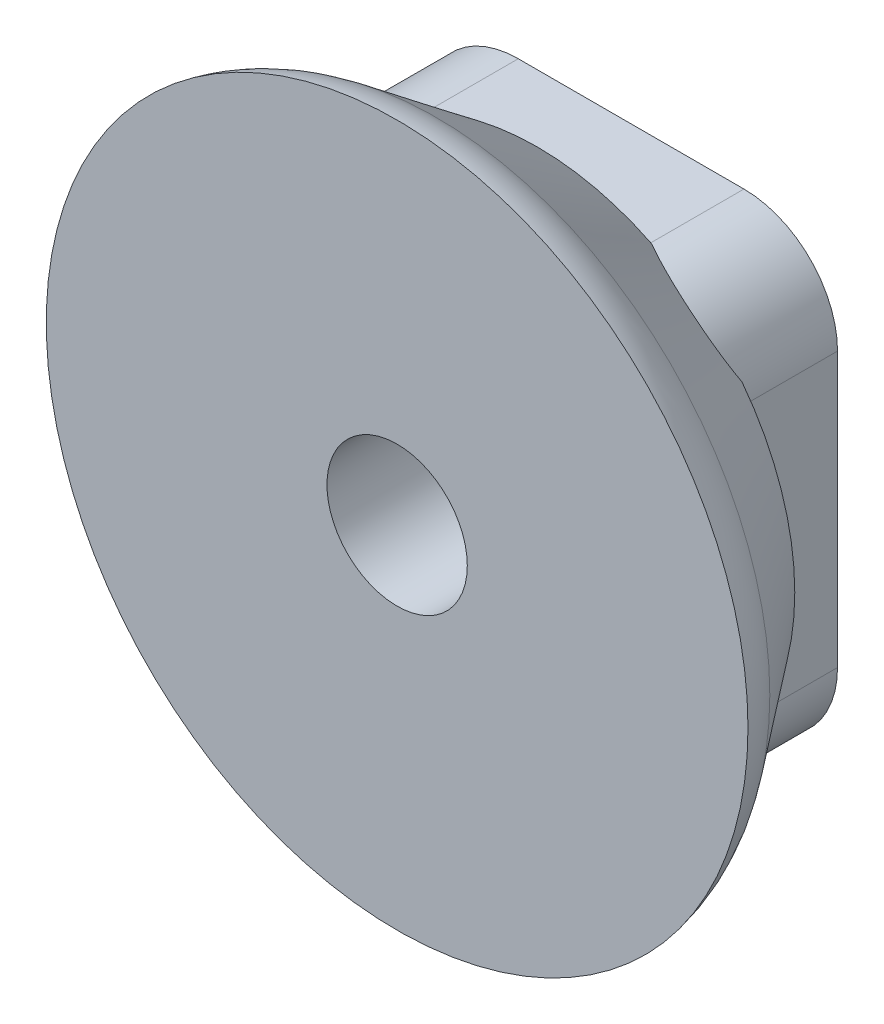
ISO-10303-21;
HEADER;
FILE_DESCRIPTION(('STEP AP214'),'2;1');
FILE_NAME('part.step','',(''),(''),'','','');
FILE_SCHEMA(('AUTOMOTIVE_DESIGN { 1 0 10303 214 1 1 1 1 }'));
ENDSEC;
DATA;
#1=APPLICATION_CONTEXT('core data for automotive mechanical design processes');
#2=APPLICATION_PROTOCOL_DEFINITION('international standard','automotive_design',2000,#1);
#3=PRODUCT_CONTEXT('',#1,'mechanical');
#4=PRODUCT('Part','Part','',(#3));
#5=PRODUCT_RELATED_PRODUCT_CATEGORY('part','',(#4));
#6=PRODUCT_DEFINITION_FORMATION('','',#4);
#7=PRODUCT_DEFINITION_CONTEXT('part definition',#1,'design');
#8=PRODUCT_DEFINITION('design','',#6,#7);
#9=PRODUCT_DEFINITION_SHAPE('','',#8);
#10=(LENGTH_UNIT() NAMED_UNIT(*) SI_UNIT(.MILLI.,.METRE.));
#11=(NAMED_UNIT(*) PLANE_ANGLE_UNIT() SI_UNIT($,.RADIAN.));
#12=(NAMED_UNIT(*) SI_UNIT($,.STERADIAN.) SOLID_ANGLE_UNIT());
#13=UNCERTAINTY_MEASURE_WITH_UNIT(LENGTH_MEASURE(1.E-05),#10,'distance_accuracy_value','');
#14=(GEOMETRIC_REPRESENTATION_CONTEXT(3) GLOBAL_UNCERTAINTY_ASSIGNED_CONTEXT((#13)) GLOBAL_UNIT_ASSIGNED_CONTEXT((#10,
#11,#12)) REPRESENTATION_CONTEXT('',''));
#15=CARTESIAN_POINT('',(0.,0.,0.));
#16=DIRECTION('',(0.,0.,1.));
#17=DIRECTION('',(1.,0.,0.));
#18=AXIS2_PLACEMENT_3D('',#15,#16,#17);
#19=CARTESIAN_POINT('',(-2.36451592644686,4.9,49.2685859538631));
#20=DIRECTION('',(0.,0.,1.));
#21=DIRECTION('',(1.,0.,0.));
#22=AXIS2_PLACEMENT_3D('',#19,#20,#21);
#23=PLANE('',#22);
#24=CARTESIAN_POINT('',(-2.36451592644686,4.9,49.2685859538631));
#25=DIRECTION('',(0.,0.,1.));
#26=DIRECTION('',(1.,0.,0.));
#27=AXIS2_PLACEMENT_3D('',#24,#25,#26);
#28=CIRCLE('',#27,5.5);
#29=CARTESIAN_POINT('',(-6.73142343295476,1.55633153114653,49.2685859538631));
#30=VERTEX_POINT('',#29);
#31=CARTESIAN_POINT('',(-6.73142343295477,8.24366846885346,49.2685859538631));
#32=VERTEX_POINT('',#31);
#33=EDGE_CURVE('E206',#30,#32,#28,.F.);
#34=ORIENTED_EDGE('',*,*,#33,.T.);
#35=CARTESIAN_POINT('',(-4.77491484269107,7.82885027226082,49.2685859538631));
#36=DIRECTION('',(0.,0.,1.));
#37=DIRECTION('',(1.,0.,0.));
#38=AXIS2_PLACEMENT_3D('',#35,#36,#37);
#39=CIRCLE('',#38,2.);
#40=CARTESIAN_POINT('',(-6.77491484269107,7.82885027226082,49.2685859538631));
#41=VERTEX_POINT('',#40);
#42=EDGE_CURVE('E282',#32,#41,#39,.T.);
#43=ORIENTED_EDGE('',*,*,#42,.T.);
#44=DIRECTION('',(0.,-1.,0.));
#45=VECTOR('',#44,1.);
#46=CARTESIAN_POINT('',(-6.77491484269107,9.82885027226082,49.2685859538631));
#47=LINE('',#46,#45);
#48=CARTESIAN_POINT('',(-6.77491484269107,1.97114972773918,49.2685859538631));
#49=VERTEX_POINT('',#48);
#50=EDGE_CURVE('E185',#41,#49,#47,.T.);
#51=ORIENTED_EDGE('',*,*,#50,.T.);
#52=CARTESIAN_POINT('',(-4.77491484269107,1.97114972773918,49.2685859538631));
#53=DIRECTION('',(0.,0.,1.));
#54=DIRECTION('',(1.,0.,0.));
#55=AXIS2_PLACEMENT_3D('',#52,#53,#54);
#56=CIRCLE('',#55,2.);
#57=EDGE_CURVE('E300',#49,#30,#56,.T.);
#58=ORIENTED_EDGE('',*,*,#57,.T.);
#59=EDGE_LOOP('',(#34,#43,#51,#58));
#60=FACE_BOUND('',#59,.T.);
#61=ADVANCED_FACE('F35',(#60),#23,.F.);
#62=CARTESIAN_POINT('',(-2.36451592644686,4.9,49.2685859538631));
#63=DIRECTION('',(0.,0.,1.));
#64=DIRECTION('',(1.,0.,0.));
#65=AXIS2_PLACEMENT_3D('',#62,#63,#64);
#66=CIRCLE('',#65,5.5);
#67=CARTESIAN_POINT('',(-4.80557126824326,9.82861530435143,49.2685859538631));
#68=VERTEX_POINT('',#67);
#69=CARTESIAN_POINT('',(0.0764421184789635,9.82866349256184,49.2685859538631));
#70=VERTEX_POINT('',#69);
#71=EDGE_CURVE('E204',#68,#70,#66,.F.);
#72=ORIENTED_EDGE('',*,*,#71,.T.);
#73=CARTESIAN_POINT('',(0.0491092827446761,7.82885027226082,49.2685859538631));
#74=DIRECTION('',(0.,0.,1.));
#75=DIRECTION('',(1.,0.,0.));
#76=AXIS2_PLACEMENT_3D('',#73,#74,#75);
#77=CIRCLE('',#76,2.);
#78=CARTESIAN_POINT('',(0.0491092827446761,9.82885027226082,49.2685859538631));
#79=VERTEX_POINT('',#78);
#80=EDGE_CURVE('E250',#70,#79,#77,.T.);
#81=ORIENTED_EDGE('',*,*,#80,.T.);
#82=DIRECTION('',(-1.,0.,0.));
#83=VECTOR('',#82,1.);
#84=CARTESIAN_POINT('',(-6.77491484269107,9.82885027226082,49.2685859538631));
#85=LINE('',#84,#83);
#86=CARTESIAN_POINT('',(-4.77491484269107,9.82885027226082,49.2685859538631));
#87=VERTEX_POINT('',#86);
#88=EDGE_CURVE('E182',#79,#87,#85,.T.);
#89=ORIENTED_EDGE('',*,*,#88,.T.);
#90=CARTESIAN_POINT('',(-4.77491484269107,7.82885027226082,49.2685859538631));
#91=DIRECTION('',(0.,0.,1.));
#92=DIRECTION('',(1.,0.,0.));
#93=AXIS2_PLACEMENT_3D('',#90,#91,#92);
#94=CIRCLE('',#93,2.);
#95=EDGE_CURVE('E283',#87,#68,#94,.T.);
#96=ORIENTED_EDGE('',*,*,#95,.T.);
#97=EDGE_LOOP('',(#72,#81,#89,#96));
#98=FACE_BOUND('',#97,.T.);
#99=ADVANCED_FACE('F324',(#98),#23,.F.);
#100=CARTESIAN_POINT('',(-2.36451592644686,4.9,49.2685859538631));
#101=DIRECTION('',(0.,0.,1.));
#102=DIRECTION('',(1.,0.,0.));
#103=AXIS2_PLACEMENT_3D('',#100,#101,#102);
#104=CIRCLE('',#103,5.5);
#105=CARTESIAN_POINT('',(2.00684319261151,8.23784652915996,49.2685859538631));
#106=VERTEX_POINT('',#105);
#107=CARTESIAN_POINT('',(2.00684319261151,1.56215347084003,49.2685859538631));
#108=VERTEX_POINT('',#107);
#109=EDGE_CURVE('E50',#106,#108,#104,.F.);
#110=ORIENTED_EDGE('',*,*,#109,.T.);
#111=CARTESIAN_POINT('',(0.0491092827446764,1.97114972773918,49.2685859538631));
#112=DIRECTION('',(0.,0.,1.));
#113=DIRECTION('',(1.,0.,0.));
#114=AXIS2_PLACEMENT_3D('',#111,#112,#113);
#115=CIRCLE('',#114,2.);
#116=CARTESIAN_POINT('',(2.04910928274468,1.97114972773918,49.2685859538631));
#117=VERTEX_POINT('',#116);
#118=EDGE_CURVE('E11',#108,#117,#115,.T.);
#119=ORIENTED_EDGE('',*,*,#118,.T.);
#120=DIRECTION('',(0.,1.,0.));
#121=VECTOR('',#120,1.);
#122=CARTESIAN_POINT('',(2.04910928274468,9.82885027226082,49.2685859538631));
#123=LINE('',#122,#121);
#124=CARTESIAN_POINT('',(2.04910928274468,7.82885027226082,49.2685859538631));
#125=VERTEX_POINT('',#124);
#126=EDGE_CURVE('E192',#117,#125,#123,.T.);
#127=ORIENTED_EDGE('',*,*,#126,.T.);
#128=CARTESIAN_POINT('',(0.0491092827446761,7.82885027226082,49.2685859538631));
#129=DIRECTION('',(0.,0.,1.));
#130=DIRECTION('',(1.,0.,0.));
#131=AXIS2_PLACEMENT_3D('',#128,#129,#130);
#132=CIRCLE('',#131,2.);
#133=EDGE_CURVE('E239',#125,#106,#132,.T.);
#134=ORIENTED_EDGE('',*,*,#133,.T.);
#135=EDGE_LOOP('',(#110,#119,#127,#134));
#136=FACE_BOUND('',#135,.T.);
#137=ADVANCED_FACE('F309',(#136),#23,.F.);
#138=CARTESIAN_POINT('',(0.,0.,47.2685859538631));
#139=DIRECTION('',(0.,0.,-1.));
#140=DIRECTION('',(-1.,0.,0.));
#141=AXIS2_PLACEMENT_3D('',#138,#139,#140);
#142=PLANE('',#141);
#143=DIRECTION('',(-1.,0.,0.));
#144=VECTOR('',#143,1.);
#145=CARTESIAN_POINT('',(-6.77491484269107,9.82885027226082,47.2685859538631));
#146=LINE('',#145,#144);
#147=CARTESIAN_POINT('',(0.0491092827446761,9.82885027226082,47.2685859538631));
#148=VERTEX_POINT('',#147);
#149=CARTESIAN_POINT('',(-4.77491484269107,9.82885027226082,47.2685859538631));
#150=VERTEX_POINT('',#149);
#151=EDGE_CURVE('E172',#148,#150,#146,.T.);
#152=ORIENTED_EDGE('',*,*,#151,.F.);
#153=CARTESIAN_POINT('',(0.0491092827446761,7.82885027226082,47.2685859538631));
#154=DIRECTION('',(0.,0.,-1.));
#155=DIRECTION('',(-1.,0.,0.));
#156=AXIS2_PLACEMENT_3D('',#153,#154,#155);
#157=CIRCLE('',#156,2.);
#158=CARTESIAN_POINT('',(2.04910928274468,7.82885027226082,47.2685859538631));
#159=VERTEX_POINT('',#158);
#160=EDGE_CURVE('E222',#148,#159,#157,.T.);
#161=ORIENTED_EDGE('',*,*,#160,.T.);
#162=DIRECTION('',(0.,1.,0.));
#163=VECTOR('',#162,1.);
#164=CARTESIAN_POINT('',(2.04910928274468,9.82885027226082,47.2685859538631));
#165=LINE('',#164,#163);
#166=CARTESIAN_POINT('',(2.04910928274468,1.97114972773918,47.2685859538631));
#167=VERTEX_POINT('',#166);
#168=EDGE_CURVE('E186',#167,#159,#165,.T.);
#169=ORIENTED_EDGE('',*,*,#168,.F.);
#170=CARTESIAN_POINT('',(0.0491092827446764,1.97114972773918,47.2685859538631));
#171=DIRECTION('',(0.,0.,-1.));
#172=DIRECTION('',(-1.,0.,0.));
#173=AXIS2_PLACEMENT_3D('',#170,#171,#172);
#174=CIRCLE('',#173,2.);
#175=CARTESIAN_POINT('',(0.0491092827446761,-0.0288502722608184,47.2685859538631));
#176=VERTEX_POINT('',#175);
#177=EDGE_CURVE('E216',#167,#176,#174,.T.);
#178=ORIENTED_EDGE('',*,*,#177,.T.);
#179=DIRECTION('',(1.,0.,0.));
#180=VECTOR('',#179,1.);
#181=CARTESIAN_POINT('',(-6.77491484269107,-0.028850272260818,47.2685859538631));
#182=LINE('',#181,#180);
#183=CARTESIAN_POINT('',(-4.77491484269107,-0.0288502722608181,47.2685859538631));
#184=VERTEX_POINT('',#183);
#185=EDGE_CURVE('E197',#184,#176,#182,.T.);
#186=ORIENTED_EDGE('',*,*,#185,.F.);
#187=CARTESIAN_POINT('',(-4.77491484269107,1.97114972773918,47.2685859538631));
#188=DIRECTION('',(0.,0.,-1.));
#189=DIRECTION('',(-1.,0.,0.));
#190=AXIS2_PLACEMENT_3D('',#187,#188,#189);
#191=CIRCLE('',#190,2.);
#192=CARTESIAN_POINT('',(-6.77491484269107,1.97114972773918,47.2685859538631));
#193=VERTEX_POINT('',#192);
#194=EDGE_CURVE('E218',#184,#193,#191,.T.);
#195=ORIENTED_EDGE('',*,*,#194,.T.);
#196=DIRECTION('',(0.,-1.,0.));
#197=VECTOR('',#196,1.);
#198=CARTESIAN_POINT('',(-6.77491484269107,9.82885027226082,47.2685859538631));
#199=LINE('',#198,#197);
#200=CARTESIAN_POINT('',(-6.77491484269107,7.82885027226082,47.2685859538631));
#201=VERTEX_POINT('',#200);
#202=EDGE_CURVE('E176',#201,#193,#199,.T.);
#203=ORIENTED_EDGE('',*,*,#202,.F.);
#204=CARTESIAN_POINT('',(-4.77491484269107,7.82885027226082,47.2685859538631));
#205=DIRECTION('',(0.,0.,-1.));
#206=DIRECTION('',(-1.,0.,0.));
#207=AXIS2_PLACEMENT_3D('',#204,#205,#206);
#208=CIRCLE('',#207,2.);
#209=EDGE_CURVE('E220',#201,#150,#208,.T.);
#210=ORIENTED_EDGE('',*,*,#209,.T.);
#211=EDGE_LOOP('',(#152,#161,#169,#178,#186,#195,#203,#210));
#212=FACE_BOUND('',#211,.T.);
#213=DIRECTION('',(-1.,0.,0.));
#214=VECTOR('',#213,1.);
#215=CARTESIAN_POINT('',(-5.57491484269107,8.62885027226082,47.2685859538631));
#216=LINE('',#215,#214);
#217=CARTESIAN_POINT('',(0.849109282744677,8.62885027226082,47.2685859538631));
#218=VERTEX_POINT('',#217);
#219=CARTESIAN_POINT('',(-5.57491484269107,8.62885027226082,47.2685859538631));
#220=VERTEX_POINT('',#219);
#221=EDGE_CURVE('E167',#218,#220,#216,.T.);
#222=ORIENTED_EDGE('',*,*,#221,.T.);
#223=DIRECTION('',(0.,-1.,0.));
#224=VECTOR('',#223,1.);
#225=CARTESIAN_POINT('',(-5.57491484269107,8.62885027226082,47.2685859538631));
#226=LINE('',#225,#224);
#227=CARTESIAN_POINT('',(-5.57491484269107,1.17114972773918,47.2685859538631));
#228=VERTEX_POINT('',#227);
#229=EDGE_CURVE('E410',#220,#228,#226,.T.);
#230=ORIENTED_EDGE('',*,*,#229,.T.);
#231=DIRECTION('',(1.,0.,0.));
#232=VECTOR('',#231,1.);
#233=CARTESIAN_POINT('',(-5.57491484269107,1.17114972773918,47.2685859538631));
#234=LINE('',#233,#232);
#235=CARTESIAN_POINT('',(0.849109282744677,1.17114972773918,47.2685859538631));
#236=VERTEX_POINT('',#235);
#237=EDGE_CURVE('E171',#228,#236,#234,.T.);
#238=ORIENTED_EDGE('',*,*,#237,.T.);
#239=DIRECTION('',(0.,1.,0.));
#240=VECTOR('',#239,1.);
#241=CARTESIAN_POINT('',(0.849109282744677,8.62885027226082,47.2685859538631));
#242=LINE('',#241,#240);
#243=EDGE_CURVE('E405',#236,#218,#242,.T.);
#244=ORIENTED_EDGE('',*,*,#243,.T.);
#245=EDGE_LOOP('',(#222,#230,#238,#244));
#246=FACE_BOUND('',#245,.T.);
#247=ADVANCED_FACE('F344',(#212,#246),#142,.T.);
#248=CARTESIAN_POINT('',(-6.77491484269107,9.82885027226082,49.2685859538631));
#249=DIRECTION('',(0.,-1.,0.));
#250=DIRECTION('',(0.,0.,-1.));
#251=AXIS2_PLACEMENT_3D('',#248,#249,#250);
#252=PLANE('',#251);
#253=ORIENTED_EDGE('',*,*,#88,.F.);
#254=DIRECTION('',(0.,0.,-1.));
#255=VECTOR('',#254,1.);
#256=CARTESIAN_POINT('',(0.0491092827446761,9.82885027226082,49.2685859538631));
#257=LINE('',#256,#255);
#258=EDGE_CURVE('E213',#79,#148,#257,.T.);
#259=ORIENTED_EDGE('',*,*,#258,.T.);
#260=ORIENTED_EDGE('',*,*,#151,.T.);
#261=DIRECTION('',(0.,0.,-1.));
#262=VECTOR('',#261,1.);
#263=CARTESIAN_POINT('',(-4.77491484269107,9.82885027226082,49.2685859538631));
#264=LINE('',#263,#262);
#265=EDGE_CURVE('E211',#150,#87,#264,.F.);
#266=ORIENTED_EDGE('',*,*,#265,.T.);
#267=EDGE_LOOP('',(#253,#259,#260,#266));
#268=FACE_BOUND('',#267,.T.);
#269=ADVANCED_FACE('F263',(#268),#252,.F.);
#270=CARTESIAN_POINT('',(-6.77491484269107,9.82885027226082,49.2685859538631));
#271=DIRECTION('',(1.,0.,0.));
#272=DIRECTION('',(0.,0.,-1.));
#273=AXIS2_PLACEMENT_3D('',#270,#271,#272);
#274=PLANE('',#273);
#275=ORIENTED_EDGE('',*,*,#50,.F.);
#276=DIRECTION('',(0.,0.,-1.));
#277=VECTOR('',#276,1.);
#278=CARTESIAN_POINT('',(-6.77491484269107,7.82885027226082,49.2685859538631));
#279=LINE('',#278,#277);
#280=EDGE_CURVE('E231',#41,#201,#279,.T.);
#281=ORIENTED_EDGE('',*,*,#280,.T.);
#282=ORIENTED_EDGE('',*,*,#202,.T.);
#283=DIRECTION('',(0.,0.,-1.));
#284=VECTOR('',#283,1.);
#285=CARTESIAN_POINT('',(-6.77491484269107,1.97114972773918,49.2685859538631));
#286=LINE('',#285,#284);
#287=EDGE_CURVE('E229',#193,#49,#286,.F.);
#288=ORIENTED_EDGE('',*,*,#287,.T.);
#289=EDGE_LOOP('',(#275,#281,#282,#288));
#290=FACE_BOUND('',#289,.T.);
#291=ADVANCED_FACE('F349',(#290),#274,.F.);
#292=CARTESIAN_POINT('',(-6.77491484269107,-0.028850272260818,49.2685859538631));
#293=DIRECTION('',(0.,1.,0.));
#294=DIRECTION('',(-1.,0.,0.));
#295=AXIS2_PLACEMENT_3D('',#292,#293,#294);
#296=PLANE('',#295);
#297=DIRECTION('',(1.,0.,0.));
#298=VECTOR('',#297,1.);
#299=CARTESIAN_POINT('',(-6.77491484269107,-0.028850272260818,49.2685859538631));
#300=LINE('',#299,#298);
#301=CARTESIAN_POINT('',(-4.77491484269107,-0.0288502722608181,49.2685859538631));
#302=VERTEX_POINT('',#301);
#303=CARTESIAN_POINT('',(0.0491092827446761,-0.0288502722608184,49.2685859538631));
#304=VERTEX_POINT('',#303);
#305=EDGE_CURVE('E189',#302,#304,#300,.T.);
#306=ORIENTED_EDGE('',*,*,#305,.F.);
#307=DIRECTION('',(0.,0.,-1.));
#308=VECTOR('',#307,1.);
#309=CARTESIAN_POINT('',(-4.77491484269107,-0.0288502722608181,49.2685859538631));
#310=LINE('',#309,#308);
#311=EDGE_CURVE('E236',#302,#184,#310,.T.);
#312=ORIENTED_EDGE('',*,*,#311,.T.);
#313=ORIENTED_EDGE('',*,*,#185,.T.);
#314=DIRECTION('',(0.,0.,-1.));
#315=VECTOR('',#314,1.);
#316=CARTESIAN_POINT('',(0.0491092827446761,-0.0288502722608184,49.2685859538631));
#317=LINE('',#316,#315);
#318=EDGE_CURVE('E234',#176,#304,#317,.F.);
#319=ORIENTED_EDGE('',*,*,#318,.T.);
#320=EDGE_LOOP('',(#306,#312,#313,#319));
#321=FACE_BOUND('',#320,.T.);
#322=ADVANCED_FACE('F339',(#321),#296,.F.);
#323=CARTESIAN_POINT('',(2.04910928274468,9.82885027226082,49.2685859538631));
#324=DIRECTION('',(-1.,0.,0.));
#325=DIRECTION('',(0.,-1.,0.));
#326=AXIS2_PLACEMENT_3D('',#323,#324,#325);
#327=PLANE('',#326);
#328=ORIENTED_EDGE('',*,*,#168,.T.);
#329=DIRECTION('',(0.,0.,-1.));
#330=VECTOR('',#329,1.);
#331=CARTESIAN_POINT('',(2.04910928274468,7.82885027226082,49.2685859538631));
#332=LINE('',#331,#330);
#333=EDGE_CURVE('E227',#159,#125,#332,.F.);
#334=ORIENTED_EDGE('',*,*,#333,.T.);
#335=ORIENTED_EDGE('',*,*,#126,.F.);
#336=DIRECTION('',(0.,0.,-1.));
#337=VECTOR('',#336,1.);
#338=CARTESIAN_POINT('',(2.04910928274468,1.97114972773918,49.2685859538631));
#339=LINE('',#338,#337);
#340=EDGE_CURVE('E224',#117,#167,#339,.T.);
#341=ORIENTED_EDGE('',*,*,#340,.T.);
#342=EDGE_LOOP('',(#328,#334,#335,#341));
#343=FACE_BOUND('',#342,.T.);
#344=ADVANCED_FACE('F312',(#343),#327,.F.);
#345=CARTESIAN_POINT('',(-5.57491484269107,8.62885027226082,49.2685859538631));
#346=DIRECTION('',(1.,0.,0.));
#347=DIRECTION('',(0.,0.,-1.));
#348=AXIS2_PLACEMENT_3D('',#345,#346,#347);
#349=PLANE('',#348);
#350=ORIENTED_EDGE('',*,*,#229,.F.);
#351=DIRECTION('',(0.,0.,-1.));
#352=VECTOR('',#351,1.);
#353=CARTESIAN_POINT('',(-5.57491484269107,8.62885027226082,49.2685859538631));
#354=LINE('',#353,#352);
#355=CARTESIAN_POINT('',(-5.57491484269107,8.62885027226082,49.2685859538631));
#356=VERTEX_POINT('',#355);
#357=EDGE_CURVE('E166',#356,#220,#354,.T.);
#358=ORIENTED_EDGE('',*,*,#357,.F.);
#359=DIRECTION('',(0.,-1.,0.));
#360=VECTOR('',#359,1.);
#361=CARTESIAN_POINT('',(-5.57491484269107,8.62885027226082,49.2685859538631));
#362=LINE('',#361,#360);
#363=CARTESIAN_POINT('',(-5.57491484269107,1.17114972773918,49.2685859538631));
#364=VERTEX_POINT('',#363);
#365=EDGE_CURVE('E151',#356,#364,#362,.T.);
#366=ORIENTED_EDGE('',*,*,#365,.T.);
#367=DIRECTION('',(0.,0.,-1.));
#368=VECTOR('',#367,1.);
#369=CARTESIAN_POINT('',(-5.57491484269107,1.17114972773918,49.2685859538631));
#370=LINE('',#369,#368);
#371=EDGE_CURVE('E163',#364,#228,#370,.T.);
#372=ORIENTED_EDGE('',*,*,#371,.T.);
#373=EDGE_LOOP('',(#350,#358,#366,#372));
#374=FACE_BOUND('',#373,.T.);
#375=ADVANCED_FACE('F162',(#374),#349,.T.);
#376=CARTESIAN_POINT('',(-5.57491484269107,1.17114972773918,49.2685859538631));
#377=DIRECTION('',(0.,1.,0.));
#378=DIRECTION('',(0.,0.,1.));
#379=AXIS2_PLACEMENT_3D('',#376,#377,#378);
#380=PLANE('',#379);
#381=ORIENTED_EDGE('',*,*,#237,.F.);
#382=ORIENTED_EDGE('',*,*,#371,.F.);
#383=DIRECTION('',(1.,0.,0.));
#384=VECTOR('',#383,1.);
#385=CARTESIAN_POINT('',(-5.57491484269107,1.17114972773918,49.2685859538631));
#386=LINE('',#385,#384);
#387=CARTESIAN_POINT('',(0.849109282744677,1.17114972773918,49.2685859538631));
#388=VERTEX_POINT('',#387);
#389=EDGE_CURVE('E147',#364,#388,#386,.T.);
#390=ORIENTED_EDGE('',*,*,#389,.T.);
#391=DIRECTION('',(0.,0.,-1.));
#392=VECTOR('',#391,1.);
#393=CARTESIAN_POINT('',(0.849109282744677,1.17114972773918,49.2685859538631));
#394=LINE('',#393,#392);
#395=EDGE_CURVE('E173',#388,#236,#394,.T.);
#396=ORIENTED_EDGE('',*,*,#395,.T.);
#397=EDGE_LOOP('',(#381,#382,#390,#396));
#398=FACE_BOUND('',#397,.T.);
#399=ADVANCED_FACE('F169',(#398),#380,.T.);
#400=CARTESIAN_POINT('',(0.849109282744677,8.62885027226082,49.2685859538631));
#401=DIRECTION('',(-1.,0.,0.));
#402=DIRECTION('',(0.,0.,1.));
#403=AXIS2_PLACEMENT_3D('',#400,#401,#402);
#404=PLANE('',#403);
#405=ORIENTED_EDGE('',*,*,#243,.F.);
#406=ORIENTED_EDGE('',*,*,#395,.F.);
#407=DIRECTION('',(0.,1.,0.));
#408=VECTOR('',#407,1.);
#409=CARTESIAN_POINT('',(0.849109282744677,8.62885027226082,49.2685859538631));
#410=LINE('',#409,#408);
#411=CARTESIAN_POINT('',(0.849109282744677,8.62885027226082,49.2685859538631));
#412=VERTEX_POINT('',#411);
#413=EDGE_CURVE('E154',#388,#412,#410,.T.);
#414=ORIENTED_EDGE('',*,*,#413,.T.);
#415=DIRECTION('',(0.,0.,-1.));
#416=VECTOR('',#415,1.);
#417=CARTESIAN_POINT('',(0.849109282744677,8.62885027226082,49.2685859538631));
#418=LINE('',#417,#416);
#419=EDGE_CURVE('E178',#412,#218,#418,.T.);
#420=ORIENTED_EDGE('',*,*,#419,.T.);
#421=EDGE_LOOP('',(#405,#406,#414,#420));
#422=FACE_BOUND('',#421,.T.);
#423=ADVANCED_FACE('F377',(#422),#404,.T.);
#424=CARTESIAN_POINT('',(-5.57491484269107,8.62885027226082,49.2685859538631));
#425=DIRECTION('',(0.,-1.,0.));
#426=DIRECTION('',(0.,0.,-1.));
#427=AXIS2_PLACEMENT_3D('',#424,#425,#426);
#428=PLANE('',#427);
#429=ORIENTED_EDGE('',*,*,#221,.F.);
#430=ORIENTED_EDGE('',*,*,#419,.F.);
#431=DIRECTION('',(-1.,0.,0.));
#432=VECTOR('',#431,1.);
#433=CARTESIAN_POINT('',(-5.57491484269107,8.62885027226082,49.2685859538631));
#434=LINE('',#433,#432);
#435=EDGE_CURVE('E417',#412,#356,#434,.T.);
#436=ORIENTED_EDGE('',*,*,#435,.T.);
#437=ORIENTED_EDGE('',*,*,#357,.T.);
#438=EDGE_LOOP('',(#429,#430,#436,#437));
#439=FACE_BOUND('',#438,.T.);
#440=ADVANCED_FACE('F373',(#439),#428,.T.);
#441=CARTESIAN_POINT('',(-2.36451592644686,4.9,49.2685859538631));
#442=DIRECTION('',(0.,0.,1.));
#443=DIRECTION('',(1.,0.,0.));
#444=AXIS2_PLACEMENT_3D('',#441,#442,#443);
#445=CIRCLE('',#444,5.5);
#446=CARTESIAN_POINT('',(0.0764421184789878,-0.0286634925618359,49.2685859538631));
#447=VERTEX_POINT('',#446);
#448=CARTESIAN_POINT('',(-4.80557126824329,-0.0286153043514278,49.2685859538631));
#449=VERTEX_POINT('',#448);
#450=EDGE_CURVE('E57',#447,#449,#445,.F.);
#451=ORIENTED_EDGE('',*,*,#450,.T.);
#452=CARTESIAN_POINT('',(-4.77491484269107,1.97114972773918,49.2685859538631));
#453=DIRECTION('',(0.,0.,1.));
#454=DIRECTION('',(1.,0.,0.));
#455=AXIS2_PLACEMENT_3D('',#452,#453,#454);
#456=CIRCLE('',#455,2.);
#457=EDGE_CURVE('E299',#449,#302,#456,.T.);
#458=ORIENTED_EDGE('',*,*,#457,.T.);
#459=ORIENTED_EDGE('',*,*,#305,.T.);
#460=CARTESIAN_POINT('',(0.0491092827446764,1.97114972773918,49.2685859538631));
#461=DIRECTION('',(0.,0.,1.));
#462=DIRECTION('',(1.,0.,0.));
#463=AXIS2_PLACEMENT_3D('',#460,#461,#462);
#464=CIRCLE('',#463,2.);
#465=EDGE_CURVE('E301',#304,#447,#464,.T.);
#466=ORIENTED_EDGE('',*,*,#465,.T.);
#467=EDGE_LOOP('',(#451,#458,#459,#466));
#468=FACE_BOUND('',#467,.T.);
#469=ADVANCED_FACE('F337',(#468),#23,.F.);
#470=CARTESIAN_POINT('',(-2.36451592644686,4.9,52.2685859538631));
#471=DIRECTION('',(0.,0.,1.));
#472=DIRECTION('',(1.,0.,0.));
#473=AXIS2_PLACEMENT_3D('',#470,#471,#472);
#474=PLANE('',#473);
#475=CARTESIAN_POINT('',(-2.36451592644686,4.9,52.2685859538631));
#476=DIRECTION('',(0.,0.,1.));
#477=DIRECTION('',(1.,0.,0.));
#478=AXIS2_PLACEMENT_3D('',#475,#476,#477);
#479=CIRCLE('',#478,7.5);
#480=CARTESIAN_POINT('',(5.13548407355314,4.9,52.2685859538631));
#481=VERTEX_POINT('',#480);
#482=EDGE_CURVE('E412',#481,#481,#479,.T.);
#483=ORIENTED_EDGE('',*,*,#482,.T.);
#484=EDGE_LOOP('',(#483));
#485=FACE_BOUND('',#484,.T.);
#486=CARTESIAN_POINT('',(-2.36451592644686,4.9,52.2685859538631));
#487=DIRECTION('',(0.,0.,1.));
#488=DIRECTION('',(1.,0.,0.));
#489=AXIS2_PLACEMENT_3D('',#486,#487,#488);
#490=CIRCLE('',#489,1.5);
#491=CARTESIAN_POINT('',(-0.864515926446856,4.9,52.2685859538631));
#492=VERTEX_POINT('',#491);
#493=EDGE_CURVE('E422',#492,#492,#490,.T.);
#494=ORIENTED_EDGE('',*,*,#493,.F.);
#495=EDGE_LOOP('',(#494));
#496=FACE_BOUND('',#495,.T.);
#497=ADVANCED_FACE('F364',(#485,#496),#474,.T.);
#498=ORIENTED_EDGE('',*,*,#365,.F.);
#499=ORIENTED_EDGE('',*,*,#435,.F.);
#500=ORIENTED_EDGE('',*,*,#413,.F.);
#501=ORIENTED_EDGE('',*,*,#389,.F.);
#502=EDGE_LOOP('',(#498,#499,#500,#501));
#503=FACE_BOUND('',#502,.T.);
#504=CARTESIAN_POINT('',(-2.36451592644686,4.9,49.2685859538631));
#505=DIRECTION('',(0.,0.,1.));
#506=DIRECTION('',(1.,0.,0.));
#507=AXIS2_PLACEMENT_3D('',#504,#505,#506);
#508=CIRCLE('',#507,1.5);
#509=CARTESIAN_POINT('',(-0.864515926446856,4.9,49.2685859538631));
#510=VERTEX_POINT('',#509);
#511=EDGE_CURVE('E423',#510,#510,#508,.T.);
#512=ORIENTED_EDGE('',*,*,#511,.T.);
#513=EDGE_LOOP('',(#512));
#514=FACE_BOUND('',#513,.T.);
#515=ADVANCED_FACE('F149',(#503,#514),#23,.F.);
#516=CARTESIAN_POINT('',(-2.36451592644686,4.9,52.2685859538631));
#517=DIRECTION('',(0.,0.,-1.));
#518=DIRECTION('',(-1.,0.,0.));
#519=AXIS2_PLACEMENT_3D('',#516,#517,#518);
#520=CYLINDRICAL_SURFACE('',#519,1.5);
#521=ORIENTED_EDGE('',*,*,#493,.T.);
#522=EDGE_LOOP('',(#521));
#523=FACE_BOUND('',#522,.T.);
#524=ORIENTED_EDGE('',*,*,#511,.F.);
#525=EDGE_LOOP('',(#524));
#526=FACE_BOUND('',#525,.T.);
#527=ADVANCED_FACE('F261',(#523,#526),#520,.F.);
#528=CARTESIAN_POINT('',(-2.36451592644686,4.9,51.9226755971039));
#529=DIRECTION('',(0.,0.,1.));
#530=DIRECTION('',(1.,0.,0.));
#531=AXIS2_PLACEMENT_3D('',#528,#529,#530);
#532=CONICAL_SURFACE('',#531,7.5,0.645771823237904);
#533=CARTESIAN_POINT('',(-2.36451592644686,4.9,51.4337486115363));
#534=DIRECTION('',(0.,0.,1.));
#535=DIRECTION('',(1.,0.,0.));
#536=AXIS2_PLACEMENT_3D('',#533,#534,#535);
#537=CIRCLE('',#536,7.13156708982099);
#538=CARTESIAN_POINT('',(4.76705116337413,4.9,51.4337486115363));
#539=VERTEX_POINT('',#538);
#540=EDGE_CURVE('E208',#539,#539,#537,.F.);
#541=ORIENTED_EDGE('',*,*,#540,.T.);
#542=EDGE_LOOP('',(#541));
#543=FACE_BOUND('',#542,.T.);
#544=ORIENTED_EDGE('',*,*,#71,.F.);
#545=CARTESIAN_POINT('',(-4.80557126824326,9.82861530435143,49.2685859538631));
#546=CARTESIAN_POINT('',(-4.84935663983022,9.82794175456917,49.2935751682384));
#547=CARTESIAN_POINT('',(-4.89360964223677,9.82582592390382,49.3176879920144));
#548=CARTESIAN_POINT('',(-4.98290737355612,9.81851172462817,49.3639947973663));
#549=CARTESIAN_POINT('',(-5.02795279165201,9.81331052945568,49.3861869980331));
#550=CARTESIAN_POINT('',(-5.16447513307351,9.79270615560487,49.4498159309427));
#551=CARTESIAN_POINT('',(-5.25681624004907,9.77230528086949,49.4880049946413));
#552=CARTESIAN_POINT('',(-5.44152942425204,9.71696299837175,49.5540402281911));
#553=CARTESIAN_POINT('',(-5.53389883845969,9.68194165499819,49.5818279209164));
#554=CARTESIAN_POINT('',(-5.71446262309666,9.59722131360925,49.6249920080296));
#555=CARTESIAN_POINT('',(-5.80266987915631,9.54757160989478,49.6404094479818));
#556=CARTESIAN_POINT('',(-5.96228314514496,9.44079625181658,49.6569209991617));
#557=CARTESIAN_POINT('',(-6.03447548173503,9.38505187346749,49.6593790316039));
#558=CARTESIAN_POINT('',(-6.17034366718352,9.26447603037349,49.6535020985243));
#559=CARTESIAN_POINT('',(-6.23401916230695,9.19964418842248,49.6451666848654));
#560=CARTESIAN_POINT('',(-6.34746550045824,9.06748103929179,49.6190472357606));
#561=CARTESIAN_POINT('',(-6.39785215225254,9.00055127350656,49.6018784277371));
#562=CARTESIAN_POINT('',(-6.48895082822051,8.86273519260278,49.5592890636539));
#563=CARTESIAN_POINT('',(-6.52964821591209,8.79184308898249,49.5338561592794));
#564=CARTESIAN_POINT('',(-6.604517359629,8.64141149956929,49.4730592289115));
#565=CARTESIAN_POINT('',(-6.6377226056586,8.56168342817986,49.4369887727946));
#566=CARTESIAN_POINT('',(-6.69281651325799,8.4022467772575,49.3577594898769));
#567=CARTESIAN_POINT('',(-6.71475050379873,8.32253942887342,49.3146299903171));
#568=CARTESIAN_POINT('',(-6.73142343295477,8.24366846885346,49.2685859538631));
#569=B_SPLINE_CURVE_WITH_KNOTS('',3,(#545,#546,#547,#548,#549,#550,#551,#552,#553,#554,#555,
#556,#557,#558,#559,#560,#561,#562,#563,#564,#565,#566,#567,#568),.UNSPECIFIED.,.F.,.F.,(4,2,2,
2,2,2,2,2,2,2,2,4),(0.,0.151199605524646,0.302537942322384,0.607001935298755,0.913152811803682,
1.21828360301494,1.49054820076707,1.76282410313646,2.01828718749205,2.2741337569024,
2.55391241690488,2.83255692353574),.UNSPECIFIED.);
#570=EDGE_CURVE('E275',#68,#32,#569,.T.);
#571=ORIENTED_EDGE('',*,*,#570,.T.);
#572=ORIENTED_EDGE('',*,*,#33,.F.);
#573=CARTESIAN_POINT('',(-6.73142343295476,1.55633153114653,49.2685859538631));
#574=CARTESIAN_POINT('',(-6.72233860536026,1.5134937167544,49.2935751682384));
#575=CARTESIAN_POINT('',(-6.71174847332323,1.47047448774181,49.3176879920144));
#576=CARTESIAN_POINT('',(-6.6873909373636,1.38425214277369,49.3639947973663));
#577=CARTESIAN_POINT('',(-6.67362062709117,1.34104889431183,49.3861869980331));
#578=CARTESIAN_POINT('',(-6.62713566070067,1.21104105674553,49.4498159309427));
#579=CARTESIAN_POINT('',(-6.58935041244584,1.12434993412181,49.4880049946413));
#580=CARTESIAN_POINT('',(-6.49950506239926,0.953734748029038,49.5540402281911));
#581=CARTESIAN_POINT('',(-6.44736703064527,0.869828676630282,49.5818279209164));
#582=CARTESIAN_POINT('',(-6.32949074798328,0.708937413494982,49.6249920080295));
#583=CARTESIAN_POINT('',(-6.26379839142413,0.631930093127292,49.6404094479817));
#584=CARTESIAN_POINT('',(-6.12830977812777,0.495841124289545,49.6569209991616));
#585=CARTESIAN_POINT('',(-6.05971771194198,0.435722095386665,49.6593790316039));
#586=CARTESIAN_POINT('',(-5.91525473860294,0.325589688308018,49.6535020985243));
#587=CARTESIAN_POINT('',(-5.83938352934534,0.275576729829606,49.6451666848654));
#588=CARTESIAN_POINT('',(-5.68786345297614,0.189676577995342,49.6190472357606));
#589=CARTESIAN_POINT('',(-5.61249015054353,0.153107827572212,49.601878427737));
#590=CARTESIAN_POINT('',(-5.45972221038811,0.0902254184305248,49.5592890636539));
#591=CARTESIAN_POINT('',(-5.38232470821146,0.0639272364126838,49.5338561592794));
#592=CARTESIAN_POINT('',(-5.22029933233116,0.0193982644379014,49.4730592289115));
#593=CARTESIAN_POINT('',(-5.13567234278281,0.0021522106473256,49.4369887727945));
#594=CARTESIAN_POINT('',(-4.96861468729268,-0.0212384724133615,49.3577594898769));
#595=CARTESIAN_POINT('',(-4.88617650866662,-0.0274278207052637,49.3146299903171));
#596=CARTESIAN_POINT('',(-4.80557126824329,-0.0286153043514284,49.2685859538631));
#597=B_SPLINE_CURVE_WITH_KNOTS('',3,(#573,#574,#575,#576,#577,#578,#579,#580,#581,#582,#583,
#584,#585,#586,#587,#588,#589,#590,#591,#592,#593,#594,#595,#596),.UNSPECIFIED.,.F.,.F.,(4,2,2,
2,2,2,2,2,2,2,2,4),(0.,0.151199605524653,0.302537942322383,0.607001935298754,0.913152811803678,
1.21828360301493,1.49054820076706,1.76282410313645,2.01828718749204,2.27413375690239,
2.55391241690485,2.83255692353569),.UNSPECIFIED.);
#598=EDGE_CURVE('E293',#30,#449,#597,.T.);
#599=ORIENTED_EDGE('',*,*,#598,.T.);
#600=ORIENTED_EDGE('',*,*,#450,.F.);
#601=CARTESIAN_POINT('',(0.0764421184789873,-0.0286634925618349,49.2685859538631));
#602=CARTESIAN_POINT('',(0.120263464166445,-0.0280622094104763,49.2936812773335));
#603=CARTESIAN_POINT('',(0.16455627039407,-0.0260171642873306,49.3179006525013));
#604=CARTESIAN_POINT('',(0.25394188198276,-0.0188403870800416,49.3644211102623));
#605=CARTESIAN_POINT('',(0.299035386463195,-0.0137058143590372,49.3867204058616));
#606=CARTESIAN_POINT('',(0.435720423528451,0.00670689557130297,49.4506740127508));
#607=CARTESIAN_POINT('',(0.528189263148502,0.026991797866376,49.4890799511169));
#608=CARTESIAN_POINT('',(0.713194260940589,0.0821400198636008,49.5555396702034));
#609=CARTESIAN_POINT('',(0.805727933502883,0.117083788740592,49.5835346904507));
#610=CARTESIAN_POINT('',(0.986642783076981,0.20170234722739,49.6270865884868));
#611=CARTESIAN_POINT('',(1.07503683542714,0.251327383317011,49.6426848300657));
#612=CARTESIAN_POINT('',(1.23494393837271,0.358071503542078,49.6594927650827));
#613=CARTESIAN_POINT('',(1.30724803883563,0.413793746460705,49.6620797116041));
#614=CARTESIAN_POINT('',(1.44334186149235,0.534357031711982,49.6564384823948));
#615=CARTESIAN_POINT('',(1.50713135960886,0.599198313936595,49.6482100220986));
#616=CARTESIAN_POINT('',(1.62073676674715,0.731348139002216,49.6222825219837));
#617=CARTESIAN_POINT('',(1.67117798853447,0.79824717449625,49.6052095370848));
#618=CARTESIAN_POINT('',(1.76238627695875,0.936005836922973,49.5628073688563));
#619=CARTESIAN_POINT('',(1.80313834476249,1.00687139725406,49.5374655273223));
#620=CARTESIAN_POINT('',(1.87873026884685,1.15848421277391,49.4763543011158));
#621=CARTESIAN_POINT('',(1.91242879005114,1.23946178895175,49.4397452113484));
#622=CARTESIAN_POINT('',(1.95420599087145,1.36087241427899,49.3793595585209));
#623=CARTESIAN_POINT('',(1.96665751685886,1.40127125662305,49.3583554825698));
#624=CARTESIAN_POINT('',(1.98879006986101,1.4818850139984,49.3146833761893));
#625=CARTESIAN_POINT('',(1.99847337471666,1.52210005330117,49.2920167332223));
#626=CARTESIAN_POINT('',(2.00684319261151,1.56215347084003,49.2685859538631));
#627=B_SPLINE_CURVE_WITH_KNOTS('',3,(#601,#602,#603,#604,#605,#606,#607,#608,#609,#610,#611,
#612,#613,#614,#615,#616,#617,#618,#619,#620,#621,#622,#623,#624,#625,#626),.UNSPECIFIED.,.F.,
.F.,(4,2,2,2,2,2,2,2,2,2,2,2,4),(0.,0.151448482297912,0.303036425699826,0.608019365283055,
0.914698440374897,1.22034988554628,1.49284587040195,1.76534902507302,2.02076879757068,
2.27658142300351,2.56049717370793,2.7020204894199,2.84342701473528),.UNSPECIFIED.);
#628=EDGE_CURVE('E44',#447,#108,#627,.T.);
#629=ORIENTED_EDGE('',*,*,#628,.T.);
#630=ORIENTED_EDGE('',*,*,#109,.F.);
#631=CARTESIAN_POINT('',(2.00684319261151,8.23784652915996,49.2685859538631));
#632=CARTESIAN_POINT('',(1.99787866930018,8.28074535433138,49.2936812773335));
#633=CARTESIAN_POINT('',(1.98740689534215,8.32383104619359,49.3179006525013));
#634=CARTESIAN_POINT('',(1.96328066621859,8.41019781502539,49.3644211102623));
#635=CARTESIAN_POINT('',(1.9496232891656,8.45347903538002,49.3867204058616));
#636=CARTESIAN_POINT('',(1.90346607401027,8.58374410964529,49.4506740127508));
#637=CARTESIAN_POINT('',(1.86588408939779,8.67063230213649,49.4890799511169));
#638=CARTESIAN_POINT('',(1.77639751401832,8.84168880866097,49.5555396702034));
#639=CARTESIAN_POINT('',(1.72441443173459,8.92583930894158,49.5835346904507));
#640=CARTESIAN_POINT('',(1.60678228261164,9.08724922415598,49.6270865884868));
#641=CARTESIAN_POINT('',(1.54117959185443,9.16453078510808,49.6426848300658));
#642=CARTESIAN_POINT('',(1.40584425888482,9.30109189386556,49.6594927650827));
#643=CARTESIAN_POINT('',(1.3373315437611,9.36141485107102,49.6620797116042));
#644=CARTESIAN_POINT('',(1.19298248070255,9.4719606891203,49.6564384823948));
#645=CARTESIAN_POINT('',(1.11714594011838,9.52218330417281,49.6482100220987));
#646=CARTESIAN_POINT('',(0.965721442013708,9.60844097727892,49.6222825219837));
#647=CARTESIAN_POINT('',(0.890415946579906,9.64516808120638,49.6052095370848));
#648=CARTESIAN_POINT('',(0.737766101643512,9.70836955106098,49.5628073688563));
#649=CARTESIAN_POINT('',(0.660418794391712,9.73482806069806,49.5374655273224));
#650=CARTESIAN_POINT('',(0.497154433796178,9.78005342278577,49.4763543011159));
#651=CARTESIAN_POINT('',(0.411229414971244,9.79765595995882,49.4397452113484));
#652=CARTESIAN_POINT('',(0.284072668950582,9.81546147573831,49.3793595585209));
#653=CARTESIAN_POINT('',(0.242038860963586,9.81996324741928,49.3583554825698));
#654=CARTESIAN_POINT('',(0.158681228879518,9.82628250005738,49.3146833761893));
#655=CARTESIAN_POINT('',(0.117356847502629,9.82810219312704,49.2920167332223));
#656=CARTESIAN_POINT('',(0.0764421184789618,9.82866349256184,49.2685859538631));
#657=B_SPLINE_CURVE_WITH_KNOTS('',3,(#631,#632,#633,#634,#635,#636,#637,#638,#639,#640,#641,
#642,#643,#644,#645,#646,#647,#648,#649,#650,#651,#652,#653,#654,#655,#656),.UNSPECIFIED.,.F.,
.F.,(4,2,2,2,2,2,2,2,2,2,2,2,4),(0.,0.15144848229791,0.303036425699827,0.608019365283061,
0.914698440374907,1.22034988554629,1.49284587040196,1.76534902507303,2.02076879757069,
2.27658142300352,2.56049717370796,2.70202048941994,2.84342701473533),.UNSPECIFIED.);
#658=EDGE_CURVE('E241',#106,#70,#657,.T.);
#659=ORIENTED_EDGE('',*,*,#658,.T.);
#660=EDGE_LOOP('',(#544,#571,#572,#599,#600,#629,#630,#659));
#661=FACE_BOUND('',#660,.T.);
#662=ADVANCED_FACE('F256',(#543,#661),#532,.T.);
#663=CARTESIAN_POINT('',(-2.36451592644686,4.9,52.6373786578404));
#664=DIRECTION('',(0.,0.,1.));
#665=DIRECTION('',(1.,0.,0.));
#666=AXIS2_PLACEMENT_3D('',#663,#664,#665);
#667=TOROIDAL_SURFACE('',#666,5.5342960697264,2.);
#668=ORIENTED_EDGE('',*,*,#540,.F.);
#669=EDGE_LOOP('',(#668));
#670=FACE_BOUND('',#669,.T.);
#671=ORIENTED_EDGE('',*,*,#482,.F.);
#672=EDGE_LOOP('',(#671));
#673=FACE_BOUND('',#672,.T.);
#674=ADVANCED_FACE('F260',(#670,#673),#667,.T.);
#675=CARTESIAN_POINT('',(0.0491092827446761,7.82885027226082,49.2685859538631));
#676=DIRECTION('',(0.,0.,-1.));
#677=DIRECTION('',(-1.,0.,0.));
#678=AXIS2_PLACEMENT_3D('',#675,#676,#677);
#679=CYLINDRICAL_SURFACE('',#678,2.);
#680=ORIENTED_EDGE('',*,*,#133,.F.);
#681=ORIENTED_EDGE('',*,*,#333,.F.);
#682=ORIENTED_EDGE('',*,*,#160,.F.);
#683=ORIENTED_EDGE('',*,*,#258,.F.);
#684=ORIENTED_EDGE('',*,*,#80,.F.);
#685=ORIENTED_EDGE('',*,*,#658,.F.);
#686=EDGE_LOOP('',(#680,#681,#682,#683,#684,#685));
#687=FACE_BOUND('',#686,.T.);
#688=ADVANCED_FACE('F252',(#687),#679,.T.);
#689=CARTESIAN_POINT('',(-4.77491484269107,7.82885027226082,49.2685859538631));
#690=DIRECTION('',(0.,0.,-1.));
#691=DIRECTION('',(-1.,0.,0.));
#692=AXIS2_PLACEMENT_3D('',#689,#690,#691);
#693=CYLINDRICAL_SURFACE('',#692,2.);
#694=ORIENTED_EDGE('',*,*,#95,.F.);
#695=ORIENTED_EDGE('',*,*,#265,.F.);
#696=ORIENTED_EDGE('',*,*,#209,.F.);
#697=ORIENTED_EDGE('',*,*,#280,.F.);
#698=ORIENTED_EDGE('',*,*,#42,.F.);
#699=ORIENTED_EDGE('',*,*,#570,.F.);
#700=EDGE_LOOP('',(#694,#695,#696,#697,#698,#699));
#701=FACE_BOUND('',#700,.T.);
#702=ADVANCED_FACE('F285',(#701),#693,.T.);
#703=CARTESIAN_POINT('',(-4.77491484269107,1.97114972773918,49.2685859538631));
#704=DIRECTION('',(0.,0.,-1.));
#705=DIRECTION('',(-1.,0.,0.));
#706=AXIS2_PLACEMENT_3D('',#703,#704,#705);
#707=CYLINDRICAL_SURFACE('',#706,2.);
#708=ORIENTED_EDGE('',*,*,#57,.F.);
#709=ORIENTED_EDGE('',*,*,#287,.F.);
#710=ORIENTED_EDGE('',*,*,#194,.F.);
#711=ORIENTED_EDGE('',*,*,#311,.F.);
#712=ORIENTED_EDGE('',*,*,#457,.F.);
#713=ORIENTED_EDGE('',*,*,#598,.F.);
#714=EDGE_LOOP('',(#708,#709,#710,#711,#712,#713));
#715=FACE_BOUND('',#714,.T.);
#716=ADVANCED_FACE('F288',(#715),#707,.T.);
#717=CARTESIAN_POINT('',(0.0491092827446764,1.97114972773918,49.2685859538631));
#718=DIRECTION('',(0.,0.,-1.));
#719=DIRECTION('',(-1.,0.,0.));
#720=AXIS2_PLACEMENT_3D('',#717,#718,#719);
#721=CYLINDRICAL_SURFACE('',#720,2.);
#722=ORIENTED_EDGE('',*,*,#465,.F.);
#723=ORIENTED_EDGE('',*,*,#318,.F.);
#724=ORIENTED_EDGE('',*,*,#177,.F.);
#725=ORIENTED_EDGE('',*,*,#340,.F.);
#726=ORIENTED_EDGE('',*,*,#118,.F.);
#727=ORIENTED_EDGE('',*,*,#628,.F.);
#728=EDGE_LOOP('',(#722,#723,#724,#725,#726,#727));
#729=FACE_BOUND('',#728,.T.);
#730=ADVANCED_FACE('F37',(#729),#721,.T.);
#731=CLOSED_SHELL('',(#61,#99,#137,#247,#269,#291,#322,#344,#375,#399,#423,#440,#469,#497,#515,
#527,#662,#674,#688,#702,#716,#730));
#732=MANIFOLD_SOLID_BREP('B2',#731);
#733=ADVANCED_BREP_SHAPE_REPRESENTATION('',(#18,#732),#14);
#734=SHAPE_DEFINITION_REPRESENTATION(#9,#733);
ENDSEC;
END-ISO-10303-21;
